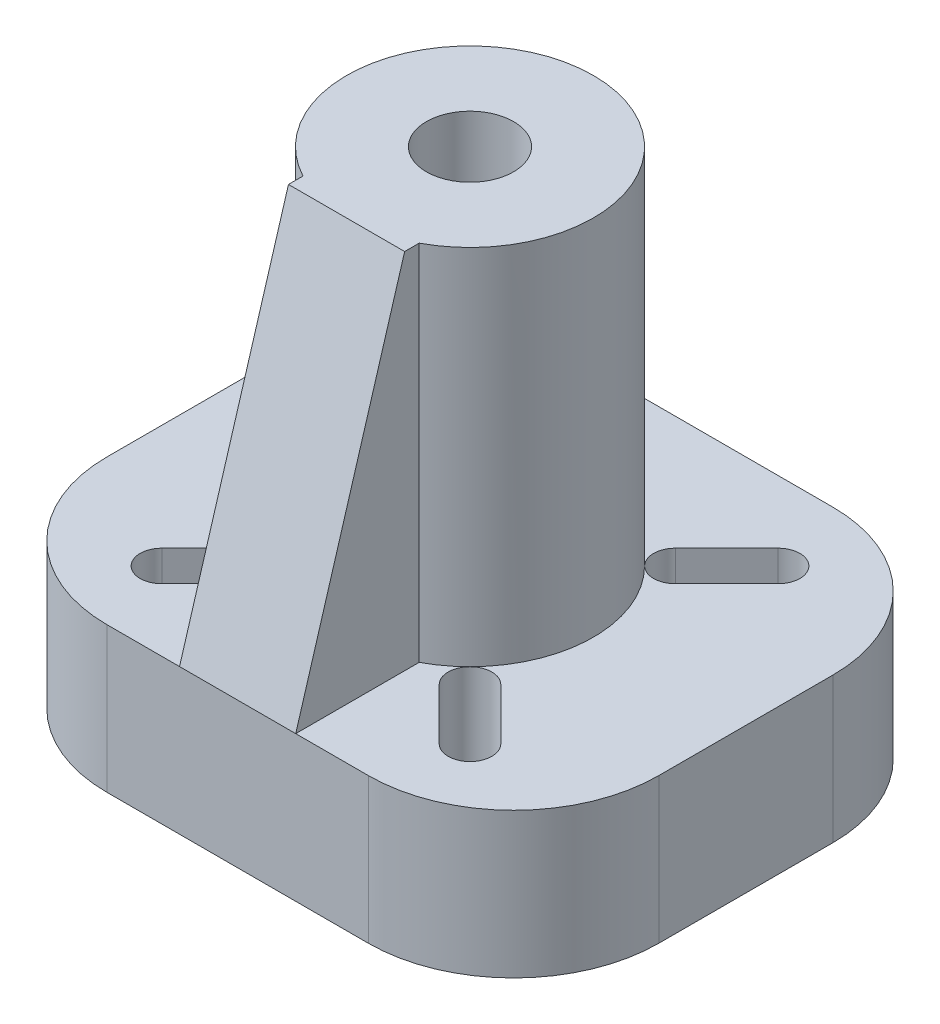
ISO-10303-21;
HEADER;
FILE_DESCRIPTION(('STEP AP214'),'2;1');
FILE_NAME('part.step','',(''),(''),'','','');
FILE_SCHEMA(('AUTOMOTIVE_DESIGN { 1 0 10303 214 1 1 1 1 }'));
ENDSEC;
DATA;
#1=APPLICATION_CONTEXT('core data for automotive mechanical design processes');
#2=APPLICATION_PROTOCOL_DEFINITION('international standard','automotive_design',2000,#1);
#3=PRODUCT_CONTEXT('',#1,'mechanical');
#4=PRODUCT('Part','Part','',(#3));
#5=PRODUCT_RELATED_PRODUCT_CATEGORY('part','',(#4));
#6=PRODUCT_DEFINITION_FORMATION('','',#4);
#7=PRODUCT_DEFINITION_CONTEXT('part definition',#1,'design');
#8=PRODUCT_DEFINITION('design','',#6,#7);
#9=PRODUCT_DEFINITION_SHAPE('','',#8);
#10=(LENGTH_UNIT() NAMED_UNIT(*) SI_UNIT(.MILLI.,.METRE.));
#11=(NAMED_UNIT(*) PLANE_ANGLE_UNIT() SI_UNIT($,.RADIAN.));
#12=(NAMED_UNIT(*) SI_UNIT($,.STERADIAN.) SOLID_ANGLE_UNIT());
#13=UNCERTAINTY_MEASURE_WITH_UNIT(LENGTH_MEASURE(1.E-05),#10,'distance_accuracy_value','');
#14=(GEOMETRIC_REPRESENTATION_CONTEXT(3) GLOBAL_UNCERTAINTY_ASSIGNED_CONTEXT((#13)) GLOBAL_UNIT_ASSIGNED_CONTEXT((#10,
#11,#12)) REPRESENTATION_CONTEXT('',''));
#15=CARTESIAN_POINT('',(0.,0.,0.));
#16=DIRECTION('',(0.,0.,1.));
#17=DIRECTION('',(1.,0.,0.));
#18=AXIS2_PLACEMENT_3D('',#15,#16,#17);
#19=CARTESIAN_POINT('',(0.,10.,0.));
#20=DIRECTION('',(0.,1.,0.));
#21=DIRECTION('',(0.,0.,1.));
#22=AXIS2_PLACEMENT_3D('',#19,#20,#21);
#23=PLANE('',#22);
#24=DIRECTION('',(1.,0.,0.));
#25=VECTOR('',#24,1.);
#26=CARTESIAN_POINT('',(-19.,10.,-24.));
#27=LINE('',#26,#25);
#28=CARTESIAN_POINT('',(4.,10.,-24.));
#29=VERTEX_POINT('',#28);
#30=CARTESIAN_POINT('',(9.,10.,-24.));
#31=VERTEX_POINT('',#30);
#32=EDGE_CURVE('E298',#29,#31,#27,.T.);
#33=ORIENTED_EDGE('',*,*,#32,.T.);
#34=CARTESIAN_POINT('',(9.,10.,-34.));
#35=DIRECTION('',(0.,1.,0.));
#36=DIRECTION('',(0.,0.,1.));
#37=AXIS2_PLACEMENT_3D('',#34,#35,#36);
#38=CIRCLE('',#37,10.);
#39=CARTESIAN_POINT('',(19.,10.,-34.));
#40=VERTEX_POINT('',#39);
#41=EDGE_CURVE('E539',#31,#40,#38,.T.);
#42=ORIENTED_EDGE('',*,*,#41,.T.);
#43=DIRECTION('',(0.,0.,-1.));
#44=VECTOR('',#43,1.);
#45=CARTESIAN_POINT('',(19.,10.,-64.));
#46=LINE('',#45,#44);
#47=CARTESIAN_POINT('',(19.,10.,-46.));
#48=VERTEX_POINT('',#47);
#49=EDGE_CURVE('E302',#40,#48,#46,.T.);
#50=ORIENTED_EDGE('',*,*,#49,.T.);
#51=CARTESIAN_POINT('',(9.,10.,-46.));
#52=DIRECTION('',(0.,1.,0.));
#53=DIRECTION('',(0.,0.,1.));
#54=AXIS2_PLACEMENT_3D('',#51,#52,#53);
#55=CIRCLE('',#54,10.);
#56=CARTESIAN_POINT('',(9.,10.,-56.));
#57=VERTEX_POINT('',#56);
#58=EDGE_CURVE('E533',#48,#57,#55,.T.);
#59=ORIENTED_EDGE('',*,*,#58,.T.);
#60=DIRECTION('',(1.,0.,0.));
#61=VECTOR('',#60,1.);
#62=CARTESIAN_POINT('',(0.,10.,-56.));
#63=LINE('',#62,#61);
#64=CARTESIAN_POINT('',(-9.,10.,-56.));
#65=VERTEX_POINT('',#64);
#66=EDGE_CURVE('E440',#65,#57,#63,.T.);
#67=ORIENTED_EDGE('',*,*,#66,.F.);
#68=CARTESIAN_POINT('',(-9.,10.,-46.));
#69=DIRECTION('',(0.,1.,0.));
#70=DIRECTION('',(0.,0.,1.));
#71=AXIS2_PLACEMENT_3D('',#68,#69,#70);
#72=CIRCLE('',#71,10.);
#73=CARTESIAN_POINT('',(-19.,10.,-46.));
#74=VERTEX_POINT('',#73);
#75=EDGE_CURVE('E530',#65,#74,#72,.T.);
#76=ORIENTED_EDGE('',*,*,#75,.T.);
#77=DIRECTION('',(0.,0.,1.));
#78=VECTOR('',#77,1.);
#79=CARTESIAN_POINT('',(-19.,10.,-64.));
#80=LINE('',#79,#78);
#81=CARTESIAN_POINT('',(-19.,10.,-34.));
#82=VERTEX_POINT('',#81);
#83=EDGE_CURVE('E294',#74,#82,#80,.T.);
#84=ORIENTED_EDGE('',*,*,#83,.T.);
#85=CARTESIAN_POINT('',(-9.,10.,-34.));
#86=DIRECTION('',(0.,1.,0.));
#87=DIRECTION('',(0.,0.,1.));
#88=AXIS2_PLACEMENT_3D('',#85,#86,#87);
#89=CIRCLE('',#88,10.);
#90=CARTESIAN_POINT('',(-9.,10.,-24.));
#91=VERTEX_POINT('',#90);
#92=EDGE_CURVE('E536',#82,#91,#89,.T.);
#93=ORIENTED_EDGE('',*,*,#92,.T.);
#94=CARTESIAN_POINT('',(-4.,10.,-24.));
#95=VERTEX_POINT('',#94);
#96=EDGE_CURVE('E299',#91,#95,#27,.T.);
#97=ORIENTED_EDGE('',*,*,#96,.T.);
#98=DIRECTION('',(0.,0.,-1.));
#99=VECTOR('',#98,1.);
#100=CARTESIAN_POINT('',(-4.,10.,-32.9285685691514));
#101=LINE('',#100,#99);
#102=CARTESIAN_POINT('',(-4.,10.,-32.4999999999999));
#103=VERTEX_POINT('',#102);
#104=EDGE_CURVE('E249',#95,#103,#101,.T.);
#105=ORIENTED_EDGE('',*,*,#104,.T.);
#106=CARTESIAN_POINT('',(0.,10.,-40.));
#107=DIRECTION('',(0.,1.,0.));
#108=DIRECTION('',(0.,0.,1.));
#109=AXIS2_PLACEMENT_3D('',#106,#107,#108);
#110=CIRCLE('',#109,8.50000000000005);
#111=CARTESIAN_POINT('',(-6.01040764008545,10.,-33.9895923599142));
#112=VERTEX_POINT('',#111);
#113=EDGE_CURVE('E289',#112,#103,#110,.T.);
#114=ORIENTED_EDGE('',*,*,#113,.F.);
#115=CARTESIAN_POINT('',(-7.07106781186523,10.,-32.9289321881343));
#116=DIRECTION('',(0.,1.,0.));
#117=DIRECTION('',(0.,0.,1.));
#118=AXIS2_PLACEMENT_3D('',#115,#116,#117);
#119=CIRCLE('',#118,1.49999999999999);
#120=CARTESIAN_POINT('',(-6.01040764008542,10.,-31.8682720163545));
#121=VERTEX_POINT('',#120);
#122=EDGE_CURVE('E503',#121,#112,#119,.T.);
#123=ORIENTED_EDGE('',*,*,#122,.F.);
#124=DIRECTION('',(0.707106781186545,0.,-0.70710678118655));
#125=VECTOR('',#124,1.);
#126=CARTESIAN_POINT('',(-18.93933982822,10.,-18.9393398282198));
#127=LINE('',#126,#125);
#128=CARTESIAN_POINT('',(-9.54594154601815,10.,-28.3327381104217));
#129=VERTEX_POINT('',#128);
#130=EDGE_CURVE('E507',#129,#121,#127,.T.);
#131=ORIENTED_EDGE('',*,*,#130,.F.);
#132=CARTESIAN_POINT('',(-10.606601717798,10.,-29.3933982822016));
#133=DIRECTION('',(0.,1.,0.));
#134=DIRECTION('',(0.,0.,1.));
#135=AXIS2_PLACEMENT_3D('',#132,#133,#134);
#136=CIRCLE('',#135,1.49999999999999);
#137=CARTESIAN_POINT('',(-11.6672618895778,10.,-30.4540584539814));
#138=VERTEX_POINT('',#137);
#139=EDGE_CURVE('E511',#138,#129,#136,.T.);
#140=ORIENTED_EDGE('',*,*,#139,.F.);
#141=DIRECTION('',(-0.707106781186544,0.,0.707106781186551));
#142=VECTOR('',#141,1.);
#143=CARTESIAN_POINT('',(-21.0606601717796,10.,-21.0606601717794));
#144=LINE('',#143,#142);
#145=CARTESIAN_POINT('',(-8.13172798364506,10.,-33.9895923599141));
#146=VERTEX_POINT('',#145);
#147=EDGE_CURVE('E498',#146,#138,#144,.T.);
#148=ORIENTED_EDGE('',*,*,#147,.F.);
#149=EDGE_CURVE('E502',#112,#146,#119,.T.);
#150=ORIENTED_EDGE('',*,*,#149,.F.);
#151=CARTESIAN_POINT('',(-6.01040764008587,10.,-46.0104076400855));
#152=VERTEX_POINT('',#151);
#153=EDGE_CURVE('E714',#152,#112,#110,.T.);
#154=ORIENTED_EDGE('',*,*,#153,.F.);
#155=CARTESIAN_POINT('',(-7.07106781186567,10.,-47.0710678118652));
#156=DIRECTION('',(0.,1.,0.));
#157=DIRECTION('',(0.,0.,1.));
#158=AXIS2_PLACEMENT_3D('',#155,#156,#157);
#159=CIRCLE('',#158,1.49999999999993);
#160=CARTESIAN_POINT('',(-8.13172798364541,10.,-46.0104076400855));
#161=VERTEX_POINT('',#160);
#162=EDGE_CURVE('E486',#161,#152,#159,.T.);
#163=ORIENTED_EDGE('',*,*,#162,.F.);
#164=DIRECTION('',(0.707106781186542,0.,0.707106781186553));
#165=VECTOR('',#164,1.);
#166=CARTESIAN_POINT('',(18.93933982822,10.,-18.9393398282197));
#167=LINE('',#166,#165);
#168=CARTESIAN_POINT('',(-11.6672618895781,10.,-49.5459415460183));
#169=VERTEX_POINT('',#168);
#170=EDGE_CURVE('E490',#169,#161,#167,.T.);
#171=ORIENTED_EDGE('',*,*,#170,.F.);
#172=CARTESIAN_POINT('',(-10.6066017177984,10.,-50.606601717798));
#173=DIRECTION('',(0.,1.,0.));
#174=DIRECTION('',(0.,0.,1.));
#175=AXIS2_PLACEMENT_3D('',#172,#173,#174);
#176=CIRCLE('',#175,1.49999999999991);
#177=CARTESIAN_POINT('',(-9.54594154601859,10.,-51.6672618895778));
#178=VERTEX_POINT('',#177);
#179=EDGE_CURVE('E494',#178,#169,#176,.T.);
#180=ORIENTED_EDGE('',*,*,#179,.F.);
#181=DIRECTION('',(-0.707106781186548,0.,-0.707106781186547));
#182=VECTOR('',#181,1.);
#183=CARTESIAN_POINT('',(21.0606601717796,10.,-21.0606601717796));
#184=LINE('',#183,#182);
#185=CARTESIAN_POINT('',(-6.01040764008589,10.,-48.1317279836451));
#186=VERTEX_POINT('',#185);
#187=EDGE_CURVE('E481',#186,#178,#184,.T.);
#188=ORIENTED_EDGE('',*,*,#187,.F.);
#189=EDGE_CURVE('E485',#152,#186,#159,.T.);
#190=ORIENTED_EDGE('',*,*,#189,.F.);
#191=CARTESIAN_POINT('',(6.01040764008553,10.,-46.0104076400858));
#192=VERTEX_POINT('',#191);
#193=EDGE_CURVE('E519',#192,#152,#110,.T.);
#194=ORIENTED_EDGE('',*,*,#193,.F.);
#195=CARTESIAN_POINT('',(7.07106781186528,10.,-47.0710678118656));
#196=DIRECTION('',(0.,1.,0.));
#197=DIRECTION('',(0.,0.,1.));
#198=AXIS2_PLACEMENT_3D('',#195,#196,#197);
#199=CIRCLE('',#198,1.49999999999995);
#200=CARTESIAN_POINT('',(6.01040764008554,10.,-48.1317279836454));
#201=VERTEX_POINT('',#200);
#202=EDGE_CURVE('E469',#201,#192,#199,.T.);
#203=ORIENTED_EDGE('',*,*,#202,.F.);
#204=DIRECTION('',(-0.707106781186552,0.,0.707106781186543));
#205=VECTOR('',#204,1.);
#206=CARTESIAN_POINT('',(-21.06066017178,10.,-21.0606601717803));
#207=LINE('',#206,#205);
#208=CARTESIAN_POINT('',(9.54594154601831,10.,-51.6672618895781));
#209=VERTEX_POINT('',#208);
#210=EDGE_CURVE('E473',#209,#201,#207,.T.);
#211=ORIENTED_EDGE('',*,*,#210,.F.);
#212=CARTESIAN_POINT('',(10.606601717798,10.,-50.6066017177984));
#213=DIRECTION('',(0.,1.,0.));
#214=DIRECTION('',(0.,0.,1.));
#215=AXIS2_PLACEMENT_3D('',#212,#213,#214);
#216=CIRCLE('',#215,1.49999999999994);
#217=CARTESIAN_POINT('',(11.6672618895779,10.,-49.5459415460186));
#218=VERTEX_POINT('',#217);
#219=EDGE_CURVE('E477',#218,#209,#216,.T.);
#220=ORIENTED_EDGE('',*,*,#219,.F.);
#221=DIRECTION('',(0.70710678118655,0.,-0.707106781186545));
#222=VECTOR('',#221,1.);
#223=CARTESIAN_POINT('',(-18.9393398282204,10.,-18.9393398282205));
#224=LINE('',#223,#222);
#225=CARTESIAN_POINT('',(8.13172798364514,10.,-46.0104076400859));
#226=VERTEX_POINT('',#225);
#227=EDGE_CURVE('E464',#226,#218,#224,.T.);
#228=ORIENTED_EDGE('',*,*,#227,.F.);
#229=EDGE_CURVE('E468',#192,#226,#199,.T.);
#230=ORIENTED_EDGE('',*,*,#229,.F.);
#231=CARTESIAN_POINT('',(6.01040764008583,10.,-33.9895923599144));
#232=VERTEX_POINT('',#231);
#233=EDGE_CURVE('E279',#232,#192,#110,.T.);
#234=ORIENTED_EDGE('',*,*,#233,.F.);
#235=CARTESIAN_POINT('',(7.07106781186562,10.,-32.9289321881347));
#236=DIRECTION('',(0.,1.,0.));
#237=DIRECTION('',(0.,0.,1.));
#238=AXIS2_PLACEMENT_3D('',#235,#236,#237);
#239=CIRCLE('',#238,1.49999999999999);
#240=CARTESIAN_POINT('',(8.13172798364544,10.,-33.9895923599145));
#241=VERTEX_POINT('',#240);
#242=EDGE_CURVE('E452',#241,#232,#239,.T.);
#243=ORIENTED_EDGE('',*,*,#242,.F.);
#244=DIRECTION('',(-0.707106781186543,0.,-0.707106781186552));
#245=VECTOR('',#244,1.);
#246=CARTESIAN_POINT('',(21.06066017178,10.,-21.0606601717797));
#247=LINE('',#246,#245);
#248=CARTESIAN_POINT('',(11.6672618895782,10.,-30.4540584539817));
#249=VERTEX_POINT('',#248);
#250=EDGE_CURVE('E456',#249,#241,#247,.T.);
#251=ORIENTED_EDGE('',*,*,#250,.F.);
#252=CARTESIAN_POINT('',(10.6066017177983,10.,-29.3933982822019));
#253=DIRECTION('',(0.,1.,0.));
#254=DIRECTION('',(0.,0.,1.));
#255=AXIS2_PLACEMENT_3D('',#252,#253,#254);
#256=CIRCLE('',#255,1.49999999999999);
#257=CARTESIAN_POINT('',(9.54594154601851,10.,-28.3327381104221));
#258=VERTEX_POINT('',#257);
#259=EDGE_CURVE('E460',#258,#249,#256,.T.);
#260=ORIENTED_EDGE('',*,*,#259,.F.);
#261=DIRECTION('',(0.707106781186543,0.,0.707106781186552));
#262=VECTOR('',#261,1.);
#263=CARTESIAN_POINT('',(18.9393398282204,10.,-18.9393398282201));
#264=LINE('',#263,#262);
#265=CARTESIAN_POINT('',(6.01040764008579,10.,-31.8682720163549));
#266=VERTEX_POINT('',#265);
#267=EDGE_CURVE('E444',#266,#258,#264,.T.);
#268=ORIENTED_EDGE('',*,*,#267,.F.);
#269=EDGE_CURVE('E451',#232,#266,#239,.T.);
#270=ORIENTED_EDGE('',*,*,#269,.F.);
#271=CARTESIAN_POINT('',(4.,10.,-32.4999999999999));
#272=VERTEX_POINT('',#271);
#273=EDGE_CURVE('E288',#272,#232,#110,.T.);
#274=ORIENTED_EDGE('',*,*,#273,.F.);
#275=DIRECTION('',(0.,0.,-1.));
#276=VECTOR('',#275,1.);
#277=CARTESIAN_POINT('',(4.,10.,-24.));
#278=LINE('',#277,#276);
#279=EDGE_CURVE('E260',#29,#272,#278,.T.);
#280=ORIENTED_EDGE('',*,*,#279,.F.);
#281=EDGE_LOOP('',(#33,#42,#50,#59,#67,#76,#84,#93,#97,#105,#114,#123,#131,#140,#148,#150,#154,
#163,#171,#180,#188,#190,#194,#203,#211,#220,#228,#230,#234,#243,#251,#260,#268,#270,#274,#280));
#282=FACE_BOUND('',#281,.T.);
#283=ADVANCED_FACE('F38',(#282),#23,.T.);
#284=CARTESIAN_POINT('',(0.,35.,-40.));
#285=DIRECTION('',(0.,-1.,0.));
#286=DIRECTION('',(0.,0.,-1.));
#287=AXIS2_PLACEMENT_3D('',#284,#285,#286);
#288=CYLINDRICAL_SURFACE('',#287,8.50000000000005);
#289=DIRECTION('',(0.,-1.,0.));
#290=VECTOR('',#289,1.);
#291=CARTESIAN_POINT('',(4.,35.,-32.4999999999999));
#292=LINE('',#291,#290);
#293=CARTESIAN_POINT('',(4.,35.,-32.4999999999999));
#294=VERTEX_POINT('',#293);
#295=EDGE_CURVE('E243',#272,#294,#292,.F.);
#296=ORIENTED_EDGE('',*,*,#295,.F.);
#297=ORIENTED_EDGE('',*,*,#273,.T.);
#298=ORIENTED_EDGE('',*,*,#233,.T.);
#299=ORIENTED_EDGE('',*,*,#193,.T.);
#300=ORIENTED_EDGE('',*,*,#153,.T.);
#301=ORIENTED_EDGE('',*,*,#113,.T.);
#302=DIRECTION('',(0.,-1.,0.));
#303=VECTOR('',#302,1.);
#304=CARTESIAN_POINT('',(-4.,35.,-32.4999999999999));
#305=LINE('',#304,#303);
#306=CARTESIAN_POINT('',(-4.,35.,-32.4999999999999));
#307=VERTEX_POINT('',#306);
#308=EDGE_CURVE('E515',#103,#307,#305,.F.);
#309=ORIENTED_EDGE('',*,*,#308,.T.);
#310=CARTESIAN_POINT('',(0.,35.,-40.));
#311=DIRECTION('',(0.,1.,0.));
#312=DIRECTION('',(0.,0.,1.));
#313=AXIS2_PLACEMENT_3D('',#310,#311,#312);
#314=CIRCLE('',#313,8.50000000000005);
#315=EDGE_CURVE('E281',#294,#307,#314,.T.);
#316=ORIENTED_EDGE('',*,*,#315,.F.);
#317=EDGE_LOOP('',(#296,#297,#298,#299,#300,#301,#309,#316));
#318=FACE_BOUND('',#317,.T.);
#319=ADVANCED_FACE('F598',(#318),#288,.T.);
#320=CARTESIAN_POINT('',(0.,0.,0.));
#321=DIRECTION('',(0.,-1.,0.));
#322=DIRECTION('',(0.,0.,-1.));
#323=AXIS2_PLACEMENT_3D('',#320,#321,#322);
#324=PLANE('',#323);
#325=DIRECTION('',(0.,0.,-1.));
#326=VECTOR('',#325,1.);
#327=CARTESIAN_POINT('',(19.,0.,0.));
#328=LINE('',#327,#326);
#329=CARTESIAN_POINT('',(19.,0.,-34.));
#330=VERTEX_POINT('',#329);
#331=CARTESIAN_POINT('',(19.,0.,-46.));
#332=VERTEX_POINT('',#331);
#333=EDGE_CURVE('E433',#330,#332,#328,.T.);
#334=ORIENTED_EDGE('',*,*,#333,.F.);
#335=CARTESIAN_POINT('',(9.,0.,-34.));
#336=DIRECTION('',(0.,-1.,0.));
#337=DIRECTION('',(0.,0.,-1.));
#338=AXIS2_PLACEMENT_3D('',#335,#336,#337);
#339=CIRCLE('',#338,10.);
#340=CARTESIAN_POINT('',(9.,0.,-24.));
#341=VERTEX_POINT('',#340);
#342=EDGE_CURVE('E555',#330,#341,#339,.T.);
#343=ORIENTED_EDGE('',*,*,#342,.T.);
#344=DIRECTION('',(-1.,0.,0.));
#345=VECTOR('',#344,1.);
#346=CARTESIAN_POINT('',(0.,0.,-24.));
#347=LINE('',#346,#345);
#348=CARTESIAN_POINT('',(-9.,0.,-24.));
#349=VERTEX_POINT('',#348);
#350=EDGE_CURVE('E306',#341,#349,#347,.T.);
#351=ORIENTED_EDGE('',*,*,#350,.T.);
#352=CARTESIAN_POINT('',(-9.,0.,-34.));
#353=DIRECTION('',(0.,-1.,0.));
#354=DIRECTION('',(0.,0.,-1.));
#355=AXIS2_PLACEMENT_3D('',#352,#353,#354);
#356=CIRCLE('',#355,10.);
#357=CARTESIAN_POINT('',(-19.,0.,-34.));
#358=VERTEX_POINT('',#357);
#359=EDGE_CURVE('E54',#349,#358,#356,.T.);
#360=ORIENTED_EDGE('',*,*,#359,.T.);
#361=DIRECTION('',(0.,0.,1.));
#362=VECTOR('',#361,1.);
#363=CARTESIAN_POINT('',(-19.,0.,0.));
#364=LINE('',#363,#362);
#365=CARTESIAN_POINT('',(-19.,0.,-46.));
#366=VERTEX_POINT('',#365);
#367=EDGE_CURVE('E437',#366,#358,#364,.T.);
#368=ORIENTED_EDGE('',*,*,#367,.F.);
#369=CARTESIAN_POINT('',(-9.,0.,-46.));
#370=DIRECTION('',(0.,-1.,0.));
#371=DIRECTION('',(0.,0.,-1.));
#372=AXIS2_PLACEMENT_3D('',#369,#370,#371);
#373=CIRCLE('',#372,10.);
#374=CARTESIAN_POINT('',(-9.,0.,-56.));
#375=VERTEX_POINT('',#374);
#376=EDGE_CURVE('E62',#366,#375,#373,.T.);
#377=ORIENTED_EDGE('',*,*,#376,.T.);
#378=DIRECTION('',(-1.,0.,0.));
#379=VECTOR('',#378,1.);
#380=CARTESIAN_POINT('',(0.,0.,-56.));
#381=LINE('',#380,#379);
#382=CARTESIAN_POINT('',(9.,0.,-56.));
#383=VERTEX_POINT('',#382);
#384=EDGE_CURVE('E290',#383,#375,#381,.T.);
#385=ORIENTED_EDGE('',*,*,#384,.F.);
#386=CARTESIAN_POINT('',(9.,0.,-46.));
#387=DIRECTION('',(0.,-1.,0.));
#388=DIRECTION('',(0.,0.,-1.));
#389=AXIS2_PLACEMENT_3D('',#386,#387,#388);
#390=CIRCLE('',#389,10.);
#391=EDGE_CURVE('E550',#383,#332,#390,.T.);
#392=ORIENTED_EDGE('',*,*,#391,.T.);
#393=EDGE_LOOP('',(#334,#343,#351,#360,#368,#377,#385,#392));
#394=FACE_BOUND('',#393,.T.);
#395=CARTESIAN_POINT('',(0.,0.,-40.));
#396=DIRECTION('',(0.,1.,0.));
#397=DIRECTION('',(0.,0.,1.));
#398=AXIS2_PLACEMENT_3D('',#395,#396,#397);
#399=CIRCLE('',#398,5.);
#400=CARTESIAN_POINT('',(0.,0.,-35.));
#401=VERTEX_POINT('',#400);
#402=EDGE_CURVE('E429',#401,#401,#399,.T.);
#403=ORIENTED_EDGE('',*,*,#402,.T.);
#404=EDGE_LOOP('',(#403));
#405=FACE_BOUND('',#404,.T.);
#406=DIRECTION('',(0.707106781186548,0.,0.707106781186547));
#407=VECTOR('',#406,1.);
#408=CARTESIAN_POINT('',(-8.13172798364529,0.,-46.0104076400856));
#409=LINE('',#408,#407);
#410=CARTESIAN_POINT('',(-11.667261889578,0.,-49.5459415460184));
#411=VERTEX_POINT('',#410);
#412=CARTESIAN_POINT('',(-8.13172798364529,0.,-46.0104076400856));
#413=VERTEX_POINT('',#412);
#414=EDGE_CURVE('E411',#411,#413,#409,.T.);
#415=ORIENTED_EDGE('',*,*,#414,.T.);
#416=CARTESIAN_POINT('',(-7.07106781186547,0.,-47.0710678118655));
#417=DIRECTION('',(0.,1.,0.));
#418=DIRECTION('',(0.,0.,1.));
#419=AXIS2_PLACEMENT_3D('',#416,#417,#418);
#420=CIRCLE('',#419,1.5);
#421=CARTESIAN_POINT('',(-6.01040764008565,0.,-48.1317279836453));
#422=VERTEX_POINT('',#421);
#423=EDGE_CURVE('E399',#413,#422,#420,.T.);
#424=ORIENTED_EDGE('',*,*,#423,.T.);
#425=DIRECTION('',(-0.707106781186548,0.,-0.707106781186547));
#426=VECTOR('',#425,1.);
#427=CARTESIAN_POINT('',(-6.01040764008565,0.,-48.1317279836453));
#428=LINE('',#427,#426);
#429=CARTESIAN_POINT('',(-9.54594154601839,0.,-51.667261889578));
#430=VERTEX_POINT('',#429);
#431=EDGE_CURVE('E403',#422,#430,#428,.T.);
#432=ORIENTED_EDGE('',*,*,#431,.T.);
#433=CARTESIAN_POINT('',(-10.6066017177982,0.,-50.6066017177982));
#434=DIRECTION('',(0.,1.,0.));
#435=DIRECTION('',(0.,0.,1.));
#436=AXIS2_PLACEMENT_3D('',#433,#434,#435);
#437=CIRCLE('',#436,1.5);
#438=EDGE_CURVE('E407',#430,#411,#437,.T.);
#439=ORIENTED_EDGE('',*,*,#438,.T.);
#440=EDGE_LOOP('',(#415,#424,#432,#439));
#441=FACE_BOUND('',#440,.T.);
#442=DIRECTION('',(-0.707106781186547,0.,0.707106781186548));
#443=VECTOR('',#442,1.);
#444=CARTESIAN_POINT('',(6.01040764008565,0.,-48.1317279836455));
#445=LINE('',#444,#443);
#446=CARTESIAN_POINT('',(9.54594154601839,0.,-51.6672618895782));
#447=VERTEX_POINT('',#446);
#448=CARTESIAN_POINT('',(6.01040764008565,0.,-48.1317279836455));
#449=VERTEX_POINT('',#448);
#450=EDGE_CURVE('E381',#447,#449,#445,.T.);
#451=ORIENTED_EDGE('',*,*,#450,.T.);
#452=CARTESIAN_POINT('',(7.07106781186551,0.,-47.0710678118657));
#453=DIRECTION('',(0.,1.,0.));
#454=DIRECTION('',(0.,0.,1.));
#455=AXIS2_PLACEMENT_3D('',#452,#453,#454);
#456=CIRCLE('',#455,1.50000000000002);
#457=CARTESIAN_POINT('',(8.13172798364532,0.,-46.0104076400858));
#458=VERTEX_POINT('',#457);
#459=EDGE_CURVE('E369',#449,#458,#456,.T.);
#460=ORIENTED_EDGE('',*,*,#459,.T.);
#461=DIRECTION('',(0.70710678118655,0.,-0.707106781186545));
#462=VECTOR('',#461,1.);
#463=CARTESIAN_POINT('',(8.13172798364532,0.,-46.0104076400858));
#464=LINE('',#463,#462);
#465=CARTESIAN_POINT('',(11.6672618895781,0.,-49.5459415460185));
#466=VERTEX_POINT('',#465);
#467=EDGE_CURVE('E373',#458,#466,#464,.T.);
#468=ORIENTED_EDGE('',*,*,#467,.T.);
#469=CARTESIAN_POINT('',(10.6066017177983,0.,-50.6066017177984));
#470=DIRECTION('',(0.,1.,0.));
#471=DIRECTION('',(0.,0.,1.));
#472=AXIS2_PLACEMENT_3D('',#469,#470,#471);
#473=CIRCLE('',#472,1.50000000000003);
#474=EDGE_CURVE('E377',#466,#447,#473,.T.);
#475=ORIENTED_EDGE('',*,*,#474,.T.);
#476=EDGE_LOOP('',(#451,#460,#468,#475));
#477=FACE_BOUND('',#476,.T.);
#478=DIRECTION('',(-0.707106781186543,0.,-0.707106781186553));
#479=VECTOR('',#478,1.);
#480=CARTESIAN_POINT('',(8.13172798364545,0.,-33.9895923599145));
#481=LINE('',#480,#479);
#482=CARTESIAN_POINT('',(11.6672618895782,0.,-30.4540584539817));
#483=VERTEX_POINT('',#482);
#484=CARTESIAN_POINT('',(8.13172798364545,0.,-33.9895923599145));
#485=VERTEX_POINT('',#484);
#486=EDGE_CURVE('E351',#483,#485,#481,.T.);
#487=ORIENTED_EDGE('',*,*,#486,.T.);
#488=CARTESIAN_POINT('',(7.07106781186562,0.,-32.9289321881347));
#489=DIRECTION('',(0.,1.,0.));
#490=DIRECTION('',(0.,0.,1.));
#491=AXIS2_PLACEMENT_3D('',#488,#489,#490);
#492=CIRCLE('',#491,1.5);
#493=CARTESIAN_POINT('',(6.01040764008579,0.,-31.8682720163549));
#494=VERTEX_POINT('',#493);
#495=EDGE_CURVE('E339',#485,#494,#492,.T.);
#496=ORIENTED_EDGE('',*,*,#495,.T.);
#497=DIRECTION('',(0.707106781186543,0.,0.707106781186552));
#498=VECTOR('',#497,1.);
#499=CARTESIAN_POINT('',(6.01040764008579,0.,-31.8682720163549));
#500=LINE('',#499,#498);
#501=CARTESIAN_POINT('',(9.54594154601851,0.,-28.3327381104221));
#502=VERTEX_POINT('',#501);
#503=EDGE_CURVE('E343',#494,#502,#500,.T.);
#504=ORIENTED_EDGE('',*,*,#503,.T.);
#505=CARTESIAN_POINT('',(10.6066017177983,0.,-29.3933982822019));
#506=DIRECTION('',(0.,1.,0.));
#507=DIRECTION('',(0.,0.,1.));
#508=AXIS2_PLACEMENT_3D('',#505,#506,#507);
#509=CIRCLE('',#508,1.5);
#510=EDGE_CURVE('E347',#502,#483,#509,.T.);
#511=ORIENTED_EDGE('',*,*,#510,.T.);
#512=EDGE_LOOP('',(#487,#496,#504,#511));
#513=FACE_BOUND('',#512,.T.);
#514=DIRECTION('',(0.707106781186555,0.,-0.70710678118654));
#515=VECTOR('',#514,1.);
#516=CARTESIAN_POINT('',(-6.01040764008554,0.,-31.8682720163548));
#517=LINE('',#516,#515);
#518=CARTESIAN_POINT('',(-9.54594154601832,0.,-28.3327381104221));
#519=VERTEX_POINT('',#518);
#520=CARTESIAN_POINT('',(-6.01040764008554,0.,-31.8682720163548));
#521=VERTEX_POINT('',#520);
#522=EDGE_CURVE('E321',#519,#521,#517,.T.);
#523=ORIENTED_EDGE('',*,*,#522,.T.);
#524=CARTESIAN_POINT('',(-7.07106781186535,0.,-32.9289321881346));
#525=DIRECTION('',(0.,1.,0.));
#526=DIRECTION('',(0.,0.,1.));
#527=AXIS2_PLACEMENT_3D('',#524,#525,#526);
#528=CIRCLE('',#527,1.5);
#529=CARTESIAN_POINT('',(-8.13172798364516,0.,-33.9895923599144));
#530=VERTEX_POINT('',#529);
#531=EDGE_CURVE('E309',#521,#530,#528,.T.);
#532=ORIENTED_EDGE('',*,*,#531,.T.);
#533=DIRECTION('',(-0.707106781186554,0.,0.707106781186541));
#534=VECTOR('',#533,1.);
#535=CARTESIAN_POINT('',(-8.13172798364516,0.,-33.9895923599144));
#536=LINE('',#535,#534);
#537=CARTESIAN_POINT('',(-11.6672618895779,0.,-30.4540584539817));
#538=VERTEX_POINT('',#537);
#539=EDGE_CURVE('E313',#530,#538,#536,.T.);
#540=ORIENTED_EDGE('',*,*,#539,.T.);
#541=CARTESIAN_POINT('',(-10.6066017177981,0.,-29.3933982822019));
#542=DIRECTION('',(0.,1.,0.));
#543=DIRECTION('',(0.,0.,1.));
#544=AXIS2_PLACEMENT_3D('',#541,#542,#543);
#545=CIRCLE('',#544,1.5);
#546=EDGE_CURVE('E317',#538,#519,#545,.T.);
#547=ORIENTED_EDGE('',*,*,#546,.T.);
#548=EDGE_LOOP('',(#523,#532,#540,#547));
#549=FACE_BOUND('',#548,.T.);
#550=ADVANCED_FACE('F578',(#394,#405,#441,#477,#513,#549),#324,.T.);
#551=CARTESIAN_POINT('',(19.,3.,0.));
#552=DIRECTION('',(-1.,0.,0.));
#553=DIRECTION('',(0.,0.,1.));
#554=AXIS2_PLACEMENT_3D('',#551,#552,#553);
#555=PLANE('',#554);
#556=ORIENTED_EDGE('',*,*,#49,.F.);
#557=DIRECTION('',(0.,1.,0.));
#558=VECTOR('',#557,1.);
#559=CARTESIAN_POINT('',(19.,0.,-34.));
#560=LINE('',#559,#558);
#561=EDGE_CURVE('E545',#40,#330,#560,.F.);
#562=ORIENTED_EDGE('',*,*,#561,.T.);
#563=ORIENTED_EDGE('',*,*,#333,.T.);
#564=DIRECTION('',(0.,-1.,0.));
#565=VECTOR('',#564,1.);
#566=CARTESIAN_POINT('',(19.,3.,-46.));
#567=LINE('',#566,#565);
#568=EDGE_CURVE('E542',#332,#48,#567,.F.);
#569=ORIENTED_EDGE('',*,*,#568,.T.);
#570=EDGE_LOOP('',(#556,#562,#563,#569));
#571=FACE_BOUND('',#570,.T.);
#572=ADVANCED_FACE('F585',(#571),#555,.F.);
#573=CARTESIAN_POINT('',(-19.,3.,0.));
#574=DIRECTION('',(1.,0.,0.));
#575=DIRECTION('',(0.,0.,-1.));
#576=AXIS2_PLACEMENT_3D('',#573,#574,#575);
#577=PLANE('',#576);
#578=ORIENTED_EDGE('',*,*,#367,.T.);
#579=DIRECTION('',(0.,-1.,0.));
#580=VECTOR('',#579,1.);
#581=CARTESIAN_POINT('',(-19.,10.,-34.));
#582=LINE('',#581,#580);
#583=EDGE_CURVE('E561',#358,#82,#582,.F.);
#584=ORIENTED_EDGE('',*,*,#583,.T.);
#585=ORIENTED_EDGE('',*,*,#83,.F.);
#586=DIRECTION('',(0.,-1.,0.));
#587=VECTOR('',#586,1.);
#588=CARTESIAN_POINT('',(-19.,3.,-46.));
#589=LINE('',#588,#587);
#590=EDGE_CURVE('E558',#74,#366,#589,.T.);
#591=ORIENTED_EDGE('',*,*,#590,.T.);
#592=EDGE_LOOP('',(#578,#584,#585,#591));
#593=FACE_BOUND('',#592,.T.);
#594=ADVANCED_FACE('F575',(#593),#577,.F.);
#595=CARTESIAN_POINT('',(0.,3.,-40.));
#596=DIRECTION('',(0.,-1.,0.));
#597=DIRECTION('',(0.,0.,-1.));
#598=AXIS2_PLACEMENT_3D('',#595,#596,#597);
#599=CYLINDRICAL_SURFACE('',#598,5.);
#600=ORIENTED_EDGE('',*,*,#402,.F.);
#601=EDGE_LOOP('',(#600));
#602=FACE_BOUND('',#601,.T.);
#603=CARTESIAN_POINT('',(0.,10.,-40.));
#604=DIRECTION('',(0.,1.,0.));
#605=DIRECTION('',(0.,0.,1.));
#606=AXIS2_PLACEMENT_3D('',#603,#604,#605);
#607=CIRCLE('',#606,4.99999999999999);
#608=CARTESIAN_POINT('',(0.,10.,-35.));
#609=VERTEX_POINT('',#608);
#610=EDGE_CURVE('E284',#609,#609,#607,.T.);
#611=ORIENTED_EDGE('',*,*,#610,.T.);
#612=EDGE_LOOP('',(#611));
#613=FACE_BOUND('',#612,.T.);
#614=ADVANCED_FACE('F674',(#602,#613),#599,.F.);
#615=CARTESIAN_POINT('',(-7.07106781186547,3.,-47.0710678118655));
#616=DIRECTION('',(0.,-1.,0.));
#617=DIRECTION('',(0.,0.,-1.));
#618=AXIS2_PLACEMENT_3D('',#615,#616,#617);
#619=CYLINDRICAL_SURFACE('',#618,1.5);
#620=ORIENTED_EDGE('',*,*,#423,.F.);
#621=DIRECTION('',(0.,-1.,0.));
#622=VECTOR('',#621,1.);
#623=CARTESIAN_POINT('',(-8.13172798364529,3.,-46.0104076400856));
#624=LINE('',#623,#622);
#625=EDGE_CURVE('E415',#161,#413,#624,.T.);
#626=ORIENTED_EDGE('',*,*,#625,.F.);
#627=ORIENTED_EDGE('',*,*,#162,.T.);
#628=ORIENTED_EDGE('',*,*,#189,.T.);
#629=DIRECTION('',(0.,-1.,0.));
#630=VECTOR('',#629,1.);
#631=CARTESIAN_POINT('',(-6.01040764008565,3.,-48.1317279836453));
#632=LINE('',#631,#630);
#633=EDGE_CURVE('E425',#186,#422,#632,.T.);
#634=ORIENTED_EDGE('',*,*,#633,.T.);
#635=EDGE_LOOP('',(#620,#626,#627,#628,#634));
#636=FACE_BOUND('',#635,.T.);
#637=ADVANCED_FACE('F670',(#636),#619,.F.);
#638=CARTESIAN_POINT('',(-6.01040764008565,3.,-48.1317279836453));
#639=DIRECTION('',(-0.707106781186547,0.,0.707106781186548));
#640=DIRECTION('',(0.707106781186548,0.,0.707106781186547));
#641=AXIS2_PLACEMENT_3D('',#638,#639,#640);
#642=PLANE('',#641);
#643=ORIENTED_EDGE('',*,*,#431,.F.);
#644=ORIENTED_EDGE('',*,*,#633,.F.);
#645=ORIENTED_EDGE('',*,*,#187,.T.);
#646=DIRECTION('',(0.,-1.,0.));
#647=VECTOR('',#646,1.);
#648=CARTESIAN_POINT('',(-9.54594154601839,3.,-51.667261889578));
#649=LINE('',#648,#647);
#650=EDGE_CURVE('E422',#178,#430,#649,.T.);
#651=ORIENTED_EDGE('',*,*,#650,.T.);
#652=EDGE_LOOP('',(#643,#644,#645,#651));
#653=FACE_BOUND('',#652,.T.);
#654=ADVANCED_FACE('F666',(#653),#642,.T.);
#655=CARTESIAN_POINT('',(-10.6066017177982,3.,-50.6066017177982));
#656=DIRECTION('',(0.,-1.,0.));
#657=DIRECTION('',(0.,0.,-1.));
#658=AXIS2_PLACEMENT_3D('',#655,#656,#657);
#659=CYLINDRICAL_SURFACE('',#658,1.5);
#660=ORIENTED_EDGE('',*,*,#438,.F.);
#661=ORIENTED_EDGE('',*,*,#650,.F.);
#662=ORIENTED_EDGE('',*,*,#179,.T.);
#663=DIRECTION('',(0.,-1.,0.));
#664=VECTOR('',#663,1.);
#665=CARTESIAN_POINT('',(-11.667261889578,3.,-49.5459415460184));
#666=LINE('',#665,#664);
#667=EDGE_CURVE('E419',#169,#411,#666,.T.);
#668=ORIENTED_EDGE('',*,*,#667,.T.);
#669=EDGE_LOOP('',(#660,#661,#662,#668));
#670=FACE_BOUND('',#669,.T.);
#671=ADVANCED_FACE('F662',(#670),#659,.F.);
#672=CARTESIAN_POINT('',(-8.13172798364529,3.,-46.0104076400856));
#673=DIRECTION('',(0.707106781186547,0.,-0.707106781186548));
#674=DIRECTION('',(-0.707106781186548,0.,-0.707106781186547));
#675=AXIS2_PLACEMENT_3D('',#672,#673,#674);
#676=PLANE('',#675);
#677=ORIENTED_EDGE('',*,*,#414,.F.);
#678=ORIENTED_EDGE('',*,*,#667,.F.);
#679=ORIENTED_EDGE('',*,*,#170,.T.);
#680=ORIENTED_EDGE('',*,*,#625,.T.);
#681=EDGE_LOOP('',(#677,#678,#679,#680));
#682=FACE_BOUND('',#681,.T.);
#683=ADVANCED_FACE('F658',(#682),#676,.T.);
#684=CARTESIAN_POINT('',(7.07106781186551,3.,-47.0710678118657));
#685=DIRECTION('',(0.,-1.,0.));
#686=DIRECTION('',(0.,0.,-1.));
#687=AXIS2_PLACEMENT_3D('',#684,#685,#686);
#688=CYLINDRICAL_SURFACE('',#687,1.50000000000002);
#689=ORIENTED_EDGE('',*,*,#459,.F.);
#690=DIRECTION('',(0.,-1.,0.));
#691=VECTOR('',#690,1.);
#692=CARTESIAN_POINT('',(6.01040764008565,3.,-48.1317279836455));
#693=LINE('',#692,#691);
#694=EDGE_CURVE('E385',#201,#449,#693,.T.);
#695=ORIENTED_EDGE('',*,*,#694,.F.);
#696=ORIENTED_EDGE('',*,*,#202,.T.);
#697=ORIENTED_EDGE('',*,*,#229,.T.);
#698=DIRECTION('',(0.,-1.,0.));
#699=VECTOR('',#698,1.);
#700=CARTESIAN_POINT('',(8.13172798364532,3.,-46.0104076400858));
#701=LINE('',#700,#699);
#702=EDGE_CURVE('E395',#226,#458,#701,.T.);
#703=ORIENTED_EDGE('',*,*,#702,.T.);
#704=EDGE_LOOP('',(#689,#695,#696,#697,#703));
#705=FACE_BOUND('',#704,.T.);
#706=ADVANCED_FACE('F654',(#705),#688,.F.);
#707=CARTESIAN_POINT('',(8.13172798364532,3.,-46.0104076400858));
#708=DIRECTION('',(-0.707106781186545,0.,-0.707106781186549));
#709=DIRECTION('',(-0.70710678118655,0.,0.707106781186545));
#710=AXIS2_PLACEMENT_3D('',#707,#708,#709);
#711=PLANE('',#710);
#712=ORIENTED_EDGE('',*,*,#467,.F.);
#713=ORIENTED_EDGE('',*,*,#702,.F.);
#714=ORIENTED_EDGE('',*,*,#227,.T.);
#715=DIRECTION('',(0.,-1.,0.));
#716=VECTOR('',#715,1.);
#717=CARTESIAN_POINT('',(11.6672618895781,3.,-49.5459415460185));
#718=LINE('',#717,#716);
#719=EDGE_CURVE('E392',#218,#466,#718,.T.);
#720=ORIENTED_EDGE('',*,*,#719,.T.);
#721=EDGE_LOOP('',(#712,#713,#714,#720));
#722=FACE_BOUND('',#721,.T.);
#723=ADVANCED_FACE('F650',(#722),#711,.T.);
#724=CARTESIAN_POINT('',(10.6066017177983,3.,-50.6066017177984));
#725=DIRECTION('',(0.,-1.,0.));
#726=DIRECTION('',(0.,0.,-1.));
#727=AXIS2_PLACEMENT_3D('',#724,#725,#726);
#728=CYLINDRICAL_SURFACE('',#727,1.50000000000003);
#729=ORIENTED_EDGE('',*,*,#474,.F.);
#730=ORIENTED_EDGE('',*,*,#719,.F.);
#731=ORIENTED_EDGE('',*,*,#219,.T.);
#732=DIRECTION('',(0.,-1.,0.));
#733=VECTOR('',#732,1.);
#734=CARTESIAN_POINT('',(9.54594154601839,3.,-51.6672618895782));
#735=LINE('',#734,#733);
#736=EDGE_CURVE('E389',#209,#447,#735,.T.);
#737=ORIENTED_EDGE('',*,*,#736,.T.);
#738=EDGE_LOOP('',(#729,#730,#731,#737));
#739=FACE_BOUND('',#738,.T.);
#740=ADVANCED_FACE('F646',(#739),#728,.F.);
#741=CARTESIAN_POINT('',(6.01040764008565,3.,-48.1317279836455));
#742=DIRECTION('',(0.707106781186548,0.,0.707106781186547));
#743=DIRECTION('',(0.707106781186547,0.,-0.707106781186548));
#744=AXIS2_PLACEMENT_3D('',#741,#742,#743);
#745=PLANE('',#744);
#746=ORIENTED_EDGE('',*,*,#450,.F.);
#747=ORIENTED_EDGE('',*,*,#736,.F.);
#748=ORIENTED_EDGE('',*,*,#210,.T.);
#749=ORIENTED_EDGE('',*,*,#694,.T.);
#750=EDGE_LOOP('',(#746,#747,#748,#749));
#751=FACE_BOUND('',#750,.T.);
#752=ADVANCED_FACE('F642',(#751),#745,.T.);
#753=CARTESIAN_POINT('',(7.07106781186562,3.,-32.9289321881347));
#754=DIRECTION('',(0.,-1.,0.));
#755=DIRECTION('',(0.,0.,-1.));
#756=AXIS2_PLACEMENT_3D('',#753,#754,#755);
#757=CYLINDRICAL_SURFACE('',#756,1.5);
#758=ORIENTED_EDGE('',*,*,#495,.F.);
#759=DIRECTION('',(0.,-1.,0.));
#760=VECTOR('',#759,1.);
#761=CARTESIAN_POINT('',(8.13172798364545,3.,-33.9895923599145));
#762=LINE('',#761,#760);
#763=EDGE_CURVE('E355',#241,#485,#762,.T.);
#764=ORIENTED_EDGE('',*,*,#763,.F.);
#765=ORIENTED_EDGE('',*,*,#242,.T.);
#766=ORIENTED_EDGE('',*,*,#269,.T.);
#767=DIRECTION('',(0.,-1.,0.));
#768=VECTOR('',#767,1.);
#769=CARTESIAN_POINT('',(6.01040764008579,3.,-31.8682720163549));
#770=LINE('',#769,#768);
#771=EDGE_CURVE('E365',#266,#494,#770,.T.);
#772=ORIENTED_EDGE('',*,*,#771,.T.);
#773=EDGE_LOOP('',(#758,#764,#765,#766,#772));
#774=FACE_BOUND('',#773,.T.);
#775=ADVANCED_FACE('F638',(#774),#757,.F.);
#776=CARTESIAN_POINT('',(6.01040764008579,3.,-31.8682720163549));
#777=DIRECTION('',(0.707106781186552,0.,-0.707106781186543));
#778=DIRECTION('',(-0.707106781186543,0.,-0.707106781186552));
#779=AXIS2_PLACEMENT_3D('',#776,#777,#778);
#780=PLANE('',#779);
#781=ORIENTED_EDGE('',*,*,#503,.F.);
#782=ORIENTED_EDGE('',*,*,#771,.F.);
#783=ORIENTED_EDGE('',*,*,#267,.T.);
#784=DIRECTION('',(0.,-1.,0.));
#785=VECTOR('',#784,1.);
#786=CARTESIAN_POINT('',(9.54594154601851,3.,-28.3327381104221));
#787=LINE('',#786,#785);
#788=EDGE_CURVE('E362',#258,#502,#787,.T.);
#789=ORIENTED_EDGE('',*,*,#788,.T.);
#790=EDGE_LOOP('',(#781,#782,#783,#789));
#791=FACE_BOUND('',#790,.T.);
#792=ADVANCED_FACE('F634',(#791),#780,.T.);
#793=CARTESIAN_POINT('',(10.6066017177983,3.,-29.3933982822019));
#794=DIRECTION('',(0.,-1.,0.));
#795=DIRECTION('',(0.,0.,-1.));
#796=AXIS2_PLACEMENT_3D('',#793,#794,#795);
#797=CYLINDRICAL_SURFACE('',#796,1.5);
#798=ORIENTED_EDGE('',*,*,#510,.F.);
#799=ORIENTED_EDGE('',*,*,#788,.F.);
#800=ORIENTED_EDGE('',*,*,#259,.T.);
#801=DIRECTION('',(0.,-1.,0.));
#802=VECTOR('',#801,1.);
#803=CARTESIAN_POINT('',(11.6672618895782,3.,-30.4540584539817));
#804=LINE('',#803,#802);
#805=EDGE_CURVE('E359',#249,#483,#804,.T.);
#806=ORIENTED_EDGE('',*,*,#805,.T.);
#807=EDGE_LOOP('',(#798,#799,#800,#806));
#808=FACE_BOUND('',#807,.T.);
#809=ADVANCED_FACE('F630',(#808),#797,.F.);
#810=CARTESIAN_POINT('',(8.13172798364545,3.,-33.9895923599145));
#811=DIRECTION('',(-0.707106781186553,0.,0.707106781186542));
#812=DIRECTION('',(0.707106781186542,0.,0.707106781186553));
#813=AXIS2_PLACEMENT_3D('',#810,#811,#812);
#814=PLANE('',#813);
#815=ORIENTED_EDGE('',*,*,#486,.F.);
#816=ORIENTED_EDGE('',*,*,#805,.F.);
#817=ORIENTED_EDGE('',*,*,#250,.T.);
#818=ORIENTED_EDGE('',*,*,#763,.T.);
#819=EDGE_LOOP('',(#815,#816,#817,#818));
#820=FACE_BOUND('',#819,.T.);
#821=ADVANCED_FACE('F626',(#820),#814,.T.);
#822=CARTESIAN_POINT('',(-7.07106781186535,3.,-32.9289321881346));
#823=DIRECTION('',(0.,-1.,0.));
#824=DIRECTION('',(0.,0.,-1.));
#825=AXIS2_PLACEMENT_3D('',#822,#823,#824);
#826=CYLINDRICAL_SURFACE('',#825,1.5);
#827=ORIENTED_EDGE('',*,*,#531,.F.);
#828=DIRECTION('',(0.,-1.,0.));
#829=VECTOR('',#828,1.);
#830=CARTESIAN_POINT('',(-6.01040764008554,3.,-31.8682720163548));
#831=LINE('',#830,#829);
#832=EDGE_CURVE('E325',#121,#521,#831,.T.);
#833=ORIENTED_EDGE('',*,*,#832,.F.);
#834=ORIENTED_EDGE('',*,*,#122,.T.);
#835=ORIENTED_EDGE('',*,*,#149,.T.);
#836=DIRECTION('',(0.,-1.,0.));
#837=VECTOR('',#836,1.);
#838=CARTESIAN_POINT('',(-8.13172798364516,3.,-33.9895923599144));
#839=LINE('',#838,#837);
#840=EDGE_CURVE('E335',#146,#530,#839,.T.);
#841=ORIENTED_EDGE('',*,*,#840,.T.);
#842=EDGE_LOOP('',(#827,#833,#834,#835,#841));
#843=FACE_BOUND('',#842,.T.);
#844=ADVANCED_FACE('F622',(#843),#826,.F.);
#845=CARTESIAN_POINT('',(-8.13172798364516,3.,-33.9895923599144));
#846=DIRECTION('',(0.707106781186541,0.,0.707106781186554));
#847=DIRECTION('',(0.707106781186554,0.,-0.707106781186541));
#848=AXIS2_PLACEMENT_3D('',#845,#846,#847);
#849=PLANE('',#848);
#850=ORIENTED_EDGE('',*,*,#539,.F.);
#851=ORIENTED_EDGE('',*,*,#840,.F.);
#852=ORIENTED_EDGE('',*,*,#147,.T.);
#853=DIRECTION('',(0.,-1.,0.));
#854=VECTOR('',#853,1.);
#855=CARTESIAN_POINT('',(-11.6672618895779,3.,-30.4540584539817));
#856=LINE('',#855,#854);
#857=EDGE_CURVE('E332',#138,#538,#856,.T.);
#858=ORIENTED_EDGE('',*,*,#857,.T.);
#859=EDGE_LOOP('',(#850,#851,#852,#858));
#860=FACE_BOUND('',#859,.T.);
#861=ADVANCED_FACE('F618',(#860),#849,.T.);
#862=CARTESIAN_POINT('',(-10.6066017177981,3.,-29.3933982822019));
#863=DIRECTION('',(0.,-1.,0.));
#864=DIRECTION('',(0.,0.,-1.));
#865=AXIS2_PLACEMENT_3D('',#862,#863,#864);
#866=CYLINDRICAL_SURFACE('',#865,1.5);
#867=ORIENTED_EDGE('',*,*,#546,.F.);
#868=ORIENTED_EDGE('',*,*,#857,.F.);
#869=ORIENTED_EDGE('',*,*,#139,.T.);
#870=DIRECTION('',(0.,-1.,0.));
#871=VECTOR('',#870,1.);
#872=CARTESIAN_POINT('',(-9.54594154601832,3.,-28.3327381104221));
#873=LINE('',#872,#871);
#874=EDGE_CURVE('E329',#129,#519,#873,.T.);
#875=ORIENTED_EDGE('',*,*,#874,.T.);
#876=EDGE_LOOP('',(#867,#868,#869,#875));
#877=FACE_BOUND('',#876,.T.);
#878=ADVANCED_FACE('F614',(#877),#866,.F.);
#879=CARTESIAN_POINT('',(-6.01040764008554,3.,-31.8682720163548));
#880=DIRECTION('',(-0.70710678118654,0.,-0.707106781186555));
#881=DIRECTION('',(-0.707106781186555,0.,0.70710678118654));
#882=AXIS2_PLACEMENT_3D('',#879,#880,#881);
#883=PLANE('',#882);
#884=ORIENTED_EDGE('',*,*,#522,.F.);
#885=ORIENTED_EDGE('',*,*,#874,.F.);
#886=ORIENTED_EDGE('',*,*,#130,.T.);
#887=ORIENTED_EDGE('',*,*,#832,.T.);
#888=EDGE_LOOP('',(#884,#885,#886,#887));
#889=FACE_BOUND('',#888,.T.);
#890=ADVANCED_FACE('F610',(#889),#883,.T.);
#891=CARTESIAN_POINT('',(0.,-34.,-24.));
#892=DIRECTION('',(0.,0.,1.));
#893=DIRECTION('',(1.,0.,0.));
#894=AXIS2_PLACEMENT_3D('',#891,#892,#893);
#895=PLANE('',#894);
#896=ORIENTED_EDGE('',*,*,#350,.F.);
#897=DIRECTION('',(0.,1.,0.));
#898=VECTOR('',#897,1.);
#899=CARTESIAN_POINT('',(9.,10.,-24.));
#900=LINE('',#899,#898);
#901=EDGE_CURVE('E526',#341,#31,#900,.T.);
#902=ORIENTED_EDGE('',*,*,#901,.T.);
#903=ORIENTED_EDGE('',*,*,#32,.F.);
#904=DIRECTION('',(-1.,0.,0.));
#905=VECTOR('',#904,1.);
#906=CARTESIAN_POINT('',(4.,10.,-24.));
#907=LINE('',#906,#905);
#908=EDGE_CURVE('E257',#29,#95,#907,.T.);
#909=ORIENTED_EDGE('',*,*,#908,.T.);
#910=ORIENTED_EDGE('',*,*,#96,.F.);
#911=DIRECTION('',(0.,-1.,0.));
#912=VECTOR('',#911,1.);
#913=CARTESIAN_POINT('',(-9.,0.,-24.));
#914=LINE('',#913,#912);
#915=EDGE_CURVE('E522',#91,#349,#914,.T.);
#916=ORIENTED_EDGE('',*,*,#915,.T.);
#917=EDGE_LOOP('',(#896,#902,#903,#909,#910,#916));
#918=FACE_BOUND('',#917,.T.);
#919=ADVANCED_FACE('F607',(#918),#895,.T.);
#920=CARTESIAN_POINT('',(0.,44.,-56.));
#921=DIRECTION('',(0.,0.,1.));
#922=DIRECTION('',(1.,0.,0.));
#923=AXIS2_PLACEMENT_3D('',#920,#921,#922);
#924=PLANE('',#923);
#925=ORIENTED_EDGE('',*,*,#66,.T.);
#926=DIRECTION('',(0.,-1.,0.));
#927=VECTOR('',#926,1.);
#928=CARTESIAN_POINT('',(9.,44.,-56.));
#929=LINE('',#928,#927);
#930=EDGE_CURVE('E11',#57,#383,#929,.T.);
#931=ORIENTED_EDGE('',*,*,#930,.T.);
#932=ORIENTED_EDGE('',*,*,#384,.T.);
#933=DIRECTION('',(0.,-1.,0.));
#934=VECTOR('',#933,1.);
#935=CARTESIAN_POINT('',(-9.,44.,-56.));
#936=LINE('',#935,#934);
#937=EDGE_CURVE('E47',#375,#65,#936,.F.);
#938=ORIENTED_EDGE('',*,*,#937,.T.);
#939=EDGE_LOOP('',(#925,#931,#932,#938));
#940=FACE_BOUND('',#939,.T.);
#941=ADVANCED_FACE('F566',(#940),#924,.F.);
#942=CARTESIAN_POINT('',(0.,35.,-40.));
#943=DIRECTION('',(0.,1.,0.));
#944=DIRECTION('',(0.,0.,1.));
#945=AXIS2_PLACEMENT_3D('',#942,#943,#944);
#946=PLANE('',#945);
#947=DIRECTION('',(0.,0.,1.));
#948=VECTOR('',#947,1.);
#949=CARTESIAN_POINT('',(4.,35.,-31.4999999999999));
#950=LINE('',#949,#948);
#951=CARTESIAN_POINT('',(4.,35.,-31.4999999999999));
#952=VERTEX_POINT('',#951);
#953=EDGE_CURVE('E237',#294,#952,#950,.T.);
#954=ORIENTED_EDGE('',*,*,#953,.F.);
#955=ORIENTED_EDGE('',*,*,#315,.T.);
#956=DIRECTION('',(0.,0.,1.));
#957=VECTOR('',#956,1.);
#958=CARTESIAN_POINT('',(-4.,35.,-31.4999999999999));
#959=LINE('',#958,#957);
#960=CARTESIAN_POINT('',(-4.,35.,-31.4999999999999));
#961=VERTEX_POINT('',#960);
#962=EDGE_CURVE('E264',#307,#961,#959,.T.);
#963=ORIENTED_EDGE('',*,*,#962,.T.);
#964=DIRECTION('',(-1.,0.,0.));
#965=VECTOR('',#964,1.);
#966=CARTESIAN_POINT('',(4.,35.,-31.4999999999999));
#967=LINE('',#966,#965);
#968=EDGE_CURVE('E254',#952,#961,#967,.T.);
#969=ORIENTED_EDGE('',*,*,#968,.F.);
#970=EDGE_LOOP('',(#954,#955,#963,#969));
#971=FACE_BOUND('',#970,.T.);
#972=CARTESIAN_POINT('',(0.,35.,-40.));
#973=DIRECTION('',(0.,1.,0.));
#974=DIRECTION('',(0.,0.,1.));
#975=AXIS2_PLACEMENT_3D('',#972,#973,#974);
#976=CIRCLE('',#975,3.);
#977=CARTESIAN_POINT('',(0.,35.,-37.));
#978=VERTEX_POINT('',#977);
#979=EDGE_CURVE('E267',#978,#978,#976,.T.);
#980=ORIENTED_EDGE('',*,*,#979,.F.);
#981=EDGE_LOOP('',(#980));
#982=FACE_BOUND('',#981,.T.);
#983=ADVANCED_FACE('F262',(#971,#982),#946,.T.);
#984=CARTESIAN_POINT('',(0.,10.,-40.));
#985=DIRECTION('',(0.,1.,0.));
#986=DIRECTION('',(0.,0.,1.));
#987=AXIS2_PLACEMENT_3D('',#984,#985,#986);
#988=PLANE('',#987);
#989=CARTESIAN_POINT('',(0.,10.,-40.));
#990=DIRECTION('',(0.,1.,0.));
#991=DIRECTION('',(0.,0.,1.));
#992=AXIS2_PLACEMENT_3D('',#989,#990,#991);
#993=CIRCLE('',#992,3.);
#994=CARTESIAN_POINT('',(0.,10.,-37.));
#995=VERTEX_POINT('',#994);
#996=EDGE_CURVE('E272',#995,#995,#993,.T.);
#997=ORIENTED_EDGE('',*,*,#996,.T.);
#998=EDGE_LOOP('',(#997));
#999=FACE_BOUND('',#998,.T.);
#1000=ORIENTED_EDGE('',*,*,#610,.F.);
#1001=EDGE_LOOP('',(#1000));
#1002=FACE_BOUND('',#1001,.T.);
#1003=ADVANCED_FACE('F770',(#999,#1002),#988,.F.);
#1004=CARTESIAN_POINT('',(0.,10.,-40.));
#1005=DIRECTION('',(0.,1.,0.));
#1006=DIRECTION('',(0.,0.,1.));
#1007=AXIS2_PLACEMENT_3D('',#1004,#1005,#1006);
#1008=CYLINDRICAL_SURFACE('',#1007,3.);
#1009=ORIENTED_EDGE('',*,*,#996,.F.);
#1010=EDGE_LOOP('',(#1009));
#1011=FACE_BOUND('',#1010,.T.);
#1012=ORIENTED_EDGE('',*,*,#979,.T.);
#1013=EDGE_LOOP('',(#1012));
#1014=FACE_BOUND('',#1013,.T.);
#1015=ADVANCED_FACE('F765',(#1011,#1014),#1008,.F.);
#1016=CARTESIAN_POINT('',(4.,0.,0.));
#1017=DIRECTION('',(-1.,0.,0.));
#1018=DIRECTION('',(0.,0.,1.));
#1019=AXIS2_PLACEMENT_3D('',#1016,#1017,#1018);
#1020=PLANE('',#1019);
#1021=ORIENTED_EDGE('',*,*,#279,.T.);
#1022=ORIENTED_EDGE('',*,*,#295,.T.);
#1023=ORIENTED_EDGE('',*,*,#953,.T.);
#1024=DIRECTION('',(0.,-0.957826285221152,0.287347885566343));
#1025=VECTOR('',#1024,1.);
#1026=CARTESIAN_POINT('',(4.,35.,-31.4999999999999));
#1027=LINE('',#1026,#1025);
#1028=EDGE_CURVE('E240',#952,#29,#1027,.T.);
#1029=ORIENTED_EDGE('',*,*,#1028,.T.);
#1030=EDGE_LOOP('',(#1021,#1022,#1023,#1029));
#1031=FACE_BOUND('',#1030,.T.);
#1032=ADVANCED_FACE('F239',(#1031),#1020,.F.);
#1033=CARTESIAN_POINT('',(-4.,0.,0.));
#1034=DIRECTION('',(-1.,0.,0.));
#1035=DIRECTION('',(0.,0.,1.));
#1036=AXIS2_PLACEMENT_3D('',#1033,#1034,#1035);
#1037=PLANE('',#1036);
#1038=ORIENTED_EDGE('',*,*,#308,.F.);
#1039=ORIENTED_EDGE('',*,*,#104,.F.);
#1040=DIRECTION('',(0.,-0.957826285221152,0.287347885566343));
#1041=VECTOR('',#1040,1.);
#1042=CARTESIAN_POINT('',(-4.,35.,-31.4999999999999));
#1043=LINE('',#1042,#1041);
#1044=EDGE_CURVE('E702',#961,#95,#1043,.T.);
#1045=ORIENTED_EDGE('',*,*,#1044,.F.);
#1046=ORIENTED_EDGE('',*,*,#962,.F.);
#1047=EDGE_LOOP('',(#1038,#1039,#1045,#1046));
#1048=FACE_BOUND('',#1047,.T.);
#1049=ADVANCED_FACE('F690',(#1048),#1037,.T.);
#1050=CARTESIAN_POINT('',(4.,35.,-31.4999999999999));
#1051=DIRECTION('',(0.,-0.287347885566343,-0.957826285221152));
#1052=DIRECTION('',(0.,0.957826285221152,-0.287347885566343));
#1053=AXIS2_PLACEMENT_3D('',#1050,#1051,#1052);
#1054=PLANE('',#1053);
#1055=ORIENTED_EDGE('',*,*,#1044,.T.);
#1056=ORIENTED_EDGE('',*,*,#908,.F.);
#1057=ORIENTED_EDGE('',*,*,#1028,.F.);
#1058=ORIENTED_EDGE('',*,*,#968,.T.);
#1059=EDGE_LOOP('',(#1055,#1056,#1057,#1058));
#1060=FACE_BOUND('',#1059,.T.);
#1061=ADVANCED_FACE('F253',(#1060),#1054,.F.);
#1062=CARTESIAN_POINT('',(9.,-34.,-34.));
#1063=DIRECTION('',(0.,-1.,0.));
#1064=DIRECTION('',(0.,0.,-1.));
#1065=AXIS2_PLACEMENT_3D('',#1062,#1063,#1064);
#1066=CYLINDRICAL_SURFACE('',#1065,10.);
#1067=ORIENTED_EDGE('',*,*,#342,.F.);
#1068=ORIENTED_EDGE('',*,*,#561,.F.);
#1069=ORIENTED_EDGE('',*,*,#41,.F.);
#1070=ORIENTED_EDGE('',*,*,#901,.F.);
#1071=EDGE_LOOP('',(#1067,#1068,#1069,#1070));
#1072=FACE_BOUND('',#1071,.T.);
#1073=ADVANCED_FACE('F594',(#1072),#1066,.T.);
#1074=CARTESIAN_POINT('',(-9.,-34.,-34.));
#1075=DIRECTION('',(0.,1.,0.));
#1076=DIRECTION('',(0.,0.,1.));
#1077=AXIS2_PLACEMENT_3D('',#1074,#1075,#1076);
#1078=CYLINDRICAL_SURFACE('',#1077,10.);
#1079=ORIENTED_EDGE('',*,*,#92,.F.);
#1080=ORIENTED_EDGE('',*,*,#583,.F.);
#1081=ORIENTED_EDGE('',*,*,#359,.F.);
#1082=ORIENTED_EDGE('',*,*,#915,.F.);
#1083=EDGE_LOOP('',(#1079,#1080,#1081,#1082));
#1084=FACE_BOUND('',#1083,.T.);
#1085=ADVANCED_FACE('F589',(#1084),#1078,.T.);
#1086=CARTESIAN_POINT('',(9.,44.,-46.));
#1087=DIRECTION('',(0.,-1.,0.));
#1088=DIRECTION('',(0.,0.,-1.));
#1089=AXIS2_PLACEMENT_3D('',#1086,#1087,#1088);
#1090=CYLINDRICAL_SURFACE('',#1089,10.);
#1091=ORIENTED_EDGE('',*,*,#58,.F.);
#1092=ORIENTED_EDGE('',*,*,#568,.F.);
#1093=ORIENTED_EDGE('',*,*,#391,.F.);
#1094=ORIENTED_EDGE('',*,*,#930,.F.);
#1095=EDGE_LOOP('',(#1091,#1092,#1093,#1094));
#1096=FACE_BOUND('',#1095,.T.);
#1097=ADVANCED_FACE('F587',(#1096),#1090,.T.);
#1098=CARTESIAN_POINT('',(-9.,3.,-46.));
#1099=DIRECTION('',(0.,-1.,0.));
#1100=DIRECTION('',(0.,0.,-1.));
#1101=AXIS2_PLACEMENT_3D('',#1098,#1099,#1100);
#1102=CYLINDRICAL_SURFACE('',#1101,10.);
#1103=ORIENTED_EDGE('',*,*,#75,.F.);
#1104=ORIENTED_EDGE('',*,*,#937,.F.);
#1105=ORIENTED_EDGE('',*,*,#376,.F.);
#1106=ORIENTED_EDGE('',*,*,#590,.F.);
#1107=EDGE_LOOP('',(#1103,#1104,#1105,#1106));
#1108=FACE_BOUND('',#1107,.T.);
#1109=ADVANCED_FACE('F40',(#1108),#1102,.T.);
#1110=CLOSED_SHELL('',(#283,#319,#550,#572,#594,#614,#637,#654,#671,#683,#706,#723,#740,#752,
#775,#792,#809,#821,#844,#861,#878,#890,#919,#941,#983,#1003,#1015,#1032,#1049,#1061,#1073,
#1085,#1097,#1109));
#1111=MANIFOLD_SOLID_BREP('B2',#1110);
#1112=ADVANCED_BREP_SHAPE_REPRESENTATION('',(#18,#1111),#14);
#1113=SHAPE_DEFINITION_REPRESENTATION(#9,#1112);
ENDSEC;
END-ISO-10303-21;
